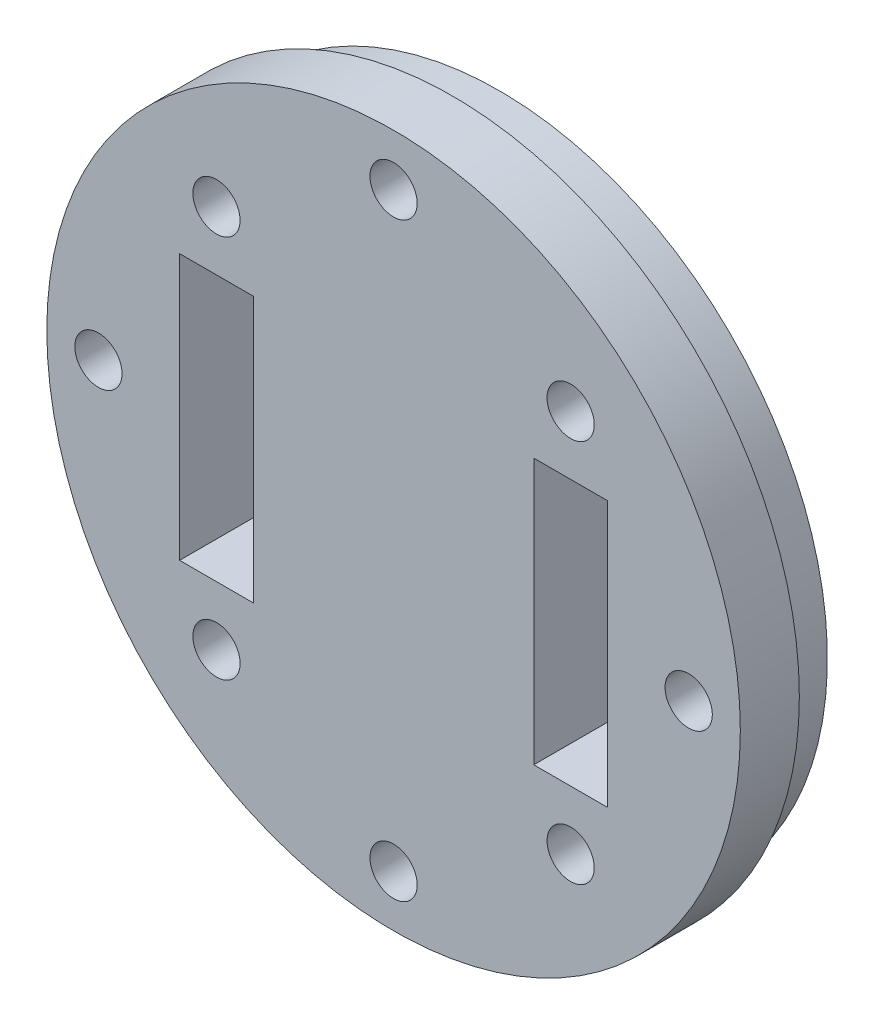
ISO-10303-21;
HEADER;
FILE_DESCRIPTION(('STEP AP214'),'2;1');
FILE_NAME('part.step','',(''),(''),'','','');
FILE_SCHEMA(('AUTOMOTIVE_DESIGN { 1 0 10303 214 1 1 1 1 }'));
ENDSEC;
DATA;
#1=APPLICATION_CONTEXT('core data for automotive mechanical design processes');
#2=APPLICATION_PROTOCOL_DEFINITION('international standard','automotive_design',2000,#1);
#3=PRODUCT_CONTEXT('',#1,'mechanical');
#4=PRODUCT('Part','Part','',(#3));
#5=PRODUCT_RELATED_PRODUCT_CATEGORY('part','',(#4));
#6=PRODUCT_DEFINITION_FORMATION('','',#4);
#7=PRODUCT_DEFINITION_CONTEXT('part definition',#1,'design');
#8=PRODUCT_DEFINITION('design','',#6,#7);
#9=PRODUCT_DEFINITION_SHAPE('','',#8);
#10=(LENGTH_UNIT() NAMED_UNIT(*) SI_UNIT(.MILLI.,.METRE.));
#11=(NAMED_UNIT(*) PLANE_ANGLE_UNIT() SI_UNIT($,.RADIAN.));
#12=(NAMED_UNIT(*) SI_UNIT($,.STERADIAN.) SOLID_ANGLE_UNIT());
#13=UNCERTAINTY_MEASURE_WITH_UNIT(LENGTH_MEASURE(1.E-05),#10,'distance_accuracy_value','');
#14=(GEOMETRIC_REPRESENTATION_CONTEXT(3) GLOBAL_UNCERTAINTY_ASSIGNED_CONTEXT((#13)) GLOBAL_UNIT_ASSIGNED_CONTEXT((#10,
#11,#12)) REPRESENTATION_CONTEXT('',''));
#15=CARTESIAN_POINT('',(0.,0.,0.));
#16=DIRECTION('',(0.,0.,1.));
#17=DIRECTION('',(1.,0.,0.));
#18=AXIS2_PLACEMENT_3D('',#15,#16,#17);
#19=CARTESIAN_POINT('',(0.,0.,4.));
#20=DIRECTION('',(0.,0.,-1.));
#21=DIRECTION('',(-1.,0.,0.));
#22=AXIS2_PLACEMENT_3D('',#19,#20,#21);
#23=CYLINDRICAL_SURFACE('',#22,23.5);
#24=CARTESIAN_POINT('',(0.,0.,4.));
#25=DIRECTION('',(0.,0.,1.));
#26=DIRECTION('',(1.,0.,0.));
#27=AXIS2_PLACEMENT_3D('',#24,#25,#26);
#28=CIRCLE('',#27,23.5);
#29=CARTESIAN_POINT('',(23.5,0.,4.));
#30=VERTEX_POINT('',#29);
#31=EDGE_CURVE('E47',#30,#30,#28,.T.);
#32=ORIENTED_EDGE('',*,*,#31,.F.);
#33=EDGE_LOOP('',(#32));
#34=FACE_BOUND('',#33,.T.);
#35=CARTESIAN_POINT('',(0.,0.,0.));
#36=DIRECTION('',(0.,0.,1.));
#37=DIRECTION('',(1.,0.,0.));
#38=AXIS2_PLACEMENT_3D('',#35,#36,#37);
#39=CIRCLE('',#38,23.5);
#40=CARTESIAN_POINT('',(23.5,0.,0.));
#41=VERTEX_POINT('',#40);
#42=EDGE_CURVE('E42',#41,#41,#39,.T.);
#43=ORIENTED_EDGE('',*,*,#42,.T.);
#44=EDGE_LOOP('',(#43));
#45=FACE_BOUND('',#44,.T.);
#46=ADVANCED_FACE('F39',(#34,#45),#23,.T.);
#47=CARTESIAN_POINT('',(0.,0.,4.));
#48=DIRECTION('',(0.,0.,1.));
#49=DIRECTION('',(1.,0.,0.));
#50=AXIS2_PLACEMENT_3D('',#47,#48,#49);
#51=PLANE('',#50);
#52=CARTESIAN_POINT('',(-12.,13.,4.));
#53=DIRECTION('',(0.,0.,-1.));
#54=DIRECTION('',(1.,0.,0.));
#55=AXIS2_PLACEMENT_3D('',#52,#53,#54);
#56=CIRCLE('',#55,1.6);
#57=CARTESIAN_POINT('',(-10.4,13.,4.));
#58=VERTEX_POINT('',#57);
#59=EDGE_CURVE('E448',#58,#58,#56,.T.);
#60=ORIENTED_EDGE('',*,*,#59,.T.);
#61=EDGE_LOOP('',(#60));
#62=FACE_BOUND('',#61,.T.);
#63=CARTESIAN_POINT('',(-12.,-13.,4.));
#64=DIRECTION('',(0.,0.,-1.));
#65=DIRECTION('',(-1.,0.,0.));
#66=AXIS2_PLACEMENT_3D('',#63,#64,#65);
#67=CIRCLE('',#66,1.6);
#68=CARTESIAN_POINT('',(-13.6,-13.,4.));
#69=VERTEX_POINT('',#68);
#70=EDGE_CURVE('E469',#69,#69,#67,.T.);
#71=ORIENTED_EDGE('',*,*,#70,.T.);
#72=EDGE_LOOP('',(#71));
#73=FACE_BOUND('',#72,.T.);
#74=CARTESIAN_POINT('',(12.,-13.,4.));
#75=DIRECTION('',(0.,0.,-1.));
#76=DIRECTION('',(1.,0.,0.));
#77=AXIS2_PLACEMENT_3D('',#74,#75,#76);
#78=CIRCLE('',#77,1.6);
#79=CARTESIAN_POINT('',(13.6,-13.,4.));
#80=VERTEX_POINT('',#79);
#81=EDGE_CURVE('E460',#80,#80,#78,.T.);
#82=ORIENTED_EDGE('',*,*,#81,.T.);
#83=EDGE_LOOP('',(#82));
#84=FACE_BOUND('',#83,.T.);
#85=CARTESIAN_POINT('',(12.,13.,4.));
#86=DIRECTION('',(0.,0.,-1.));
#87=DIRECTION('',(-1.,0.,0.));
#88=AXIS2_PLACEMENT_3D('',#85,#86,#87);
#89=CIRCLE('',#88,1.6);
#90=CARTESIAN_POINT('',(10.4,13.,4.));
#91=VERTEX_POINT('',#90);
#92=EDGE_CURVE('E165',#91,#91,#89,.T.);
#93=ORIENTED_EDGE('',*,*,#92,.T.);
#94=EDGE_LOOP('',(#93));
#95=FACE_BOUND('',#94,.T.);
#96=DIRECTION('',(0.,1.,0.));
#97=VECTOR('',#96,1.);
#98=CARTESIAN_POINT('',(-14.5,9.,4.));
#99=LINE('',#98,#97);
#100=CARTESIAN_POINT('',(-14.5,-9.,4.));
#101=VERTEX_POINT('',#100);
#102=CARTESIAN_POINT('',(-14.5,9.,4.));
#103=VERTEX_POINT('',#102);
#104=EDGE_CURVE('E109',#101,#103,#99,.T.);
#105=ORIENTED_EDGE('',*,*,#104,.T.);
#106=DIRECTION('',(1.,0.,0.));
#107=VECTOR('',#106,1.);
#108=CARTESIAN_POINT('',(-9.5,9.,4.));
#109=LINE('',#108,#107);
#110=CARTESIAN_POINT('',(-9.5,9.,4.));
#111=VERTEX_POINT('',#110);
#112=EDGE_CURVE('E120',#103,#111,#109,.T.);
#113=ORIENTED_EDGE('',*,*,#112,.T.);
#114=DIRECTION('',(0.,-1.,0.));
#115=VECTOR('',#114,1.);
#116=CARTESIAN_POINT('',(-9.5,9.,4.));
#117=LINE('',#116,#115);
#118=CARTESIAN_POINT('',(-9.5,-9.,4.));
#119=VERTEX_POINT('',#118);
#120=EDGE_CURVE('E55',#111,#119,#117,.T.);
#121=ORIENTED_EDGE('',*,*,#120,.T.);
#122=DIRECTION('',(-1.,0.,0.));
#123=VECTOR('',#122,1.);
#124=CARTESIAN_POINT('',(-9.5,-9.,4.));
#125=LINE('',#124,#123);
#126=EDGE_CURVE('E117',#119,#101,#125,.T.);
#127=ORIENTED_EDGE('',*,*,#126,.T.);
#128=EDGE_LOOP('',(#105,#113,#121,#127));
#129=FACE_BOUND('',#128,.T.);
#130=DIRECTION('',(0.,1.,0.));
#131=VECTOR('',#130,1.);
#132=CARTESIAN_POINT('',(9.5,9.,4.));
#133=LINE('',#132,#131);
#134=CARTESIAN_POINT('',(9.49999999999999,-9.,4.));
#135=VERTEX_POINT('',#134);
#136=CARTESIAN_POINT('',(9.5,9.,4.));
#137=VERTEX_POINT('',#136);
#138=EDGE_CURVE('E150',#135,#137,#133,.T.);
#139=ORIENTED_EDGE('',*,*,#138,.T.);
#140=DIRECTION('',(1.,0.,0.));
#141=VECTOR('',#140,1.);
#142=CARTESIAN_POINT('',(9.5,9.,4.));
#143=LINE('',#142,#141);
#144=CARTESIAN_POINT('',(14.5,9.,4.));
#145=VERTEX_POINT('',#144);
#146=EDGE_CURVE('E153',#137,#145,#143,.T.);
#147=ORIENTED_EDGE('',*,*,#146,.T.);
#148=DIRECTION('',(0.,-1.,0.));
#149=VECTOR('',#148,1.);
#150=CARTESIAN_POINT('',(14.5,9.,4.));
#151=LINE('',#150,#149);
#152=CARTESIAN_POINT('',(14.5,-9.,4.));
#153=VERTEX_POINT('',#152);
#154=EDGE_CURVE('E63',#145,#153,#151,.T.);
#155=ORIENTED_EDGE('',*,*,#154,.T.);
#156=DIRECTION('',(-1.,0.,0.));
#157=VECTOR('',#156,1.);
#158=CARTESIAN_POINT('',(9.49999999999999,-9.,4.));
#159=LINE('',#158,#157);
#160=EDGE_CURVE('E158',#153,#135,#159,.T.);
#161=ORIENTED_EDGE('',*,*,#160,.T.);
#162=EDGE_LOOP('',(#139,#147,#155,#161));
#163=FACE_BOUND('',#162,.T.);
#164=CARTESIAN_POINT('',(0.,20.,4.));
#165=DIRECTION('',(0.,0.,-1.));
#166=DIRECTION('',(-1.,0.,0.));
#167=AXIS2_PLACEMENT_3D('',#164,#165,#166);
#168=CIRCLE('',#167,1.6);
#169=CARTESIAN_POINT('',(-1.6,20.,4.));
#170=VERTEX_POINT('',#169);
#171=EDGE_CURVE('E180',#170,#170,#168,.T.);
#172=ORIENTED_EDGE('',*,*,#171,.T.);
#173=EDGE_LOOP('',(#172));
#174=FACE_BOUND('',#173,.T.);
#175=CARTESIAN_POINT('',(-20.,0.,4.));
#176=DIRECTION('',(0.,0.,-1.));
#177=DIRECTION('',(-1.,0.,0.));
#178=AXIS2_PLACEMENT_3D('',#175,#176,#177);
#179=CIRCLE('',#178,1.6);
#180=CARTESIAN_POINT('',(-21.6,0.,4.));
#181=VERTEX_POINT('',#180);
#182=EDGE_CURVE('E187',#181,#181,#179,.T.);
#183=ORIENTED_EDGE('',*,*,#182,.T.);
#184=EDGE_LOOP('',(#183));
#185=FACE_BOUND('',#184,.T.);
#186=CARTESIAN_POINT('',(0.,-20.,4.));
#187=DIRECTION('',(0.,0.,-1.));
#188=DIRECTION('',(-1.,0.,0.));
#189=AXIS2_PLACEMENT_3D('',#186,#187,#188);
#190=CIRCLE('',#189,1.6);
#191=CARTESIAN_POINT('',(-1.6,-20.,4.));
#192=VERTEX_POINT('',#191);
#193=EDGE_CURVE('E193',#192,#192,#190,.T.);
#194=ORIENTED_EDGE('',*,*,#193,.T.);
#195=EDGE_LOOP('',(#194));
#196=FACE_BOUND('',#195,.T.);
#197=CARTESIAN_POINT('',(20.,0.,4.));
#198=DIRECTION('',(0.,0.,-1.));
#199=DIRECTION('',(-1.,0.,0.));
#200=AXIS2_PLACEMENT_3D('',#197,#198,#199);
#201=CIRCLE('',#200,1.6);
#202=CARTESIAN_POINT('',(18.4,0.,4.));
#203=VERTEX_POINT('',#202);
#204=EDGE_CURVE('E199',#203,#203,#201,.T.);
#205=ORIENTED_EDGE('',*,*,#204,.T.);
#206=EDGE_LOOP('',(#205));
#207=FACE_BOUND('',#206,.T.);
#208=ORIENTED_EDGE('',*,*,#31,.T.);
#209=EDGE_LOOP('',(#208));
#210=FACE_BOUND('',#209,.T.);
#211=ADVANCED_FACE('F124',(#62,#73,#84,#95,#129,#163,#174,#185,#196,#207,#210),#51,.T.);
#212=CARTESIAN_POINT('',(0.,0.,0.));
#213=DIRECTION('',(0.,0.,1.));
#214=DIRECTION('',(1.,0.,0.));
#215=AXIS2_PLACEMENT_3D('',#212,#213,#214);
#216=PLANE('',#215);
#217=CARTESIAN_POINT('',(0.,0.,0.));
#218=DIRECTION('',(0.,0.,-1.));
#219=DIRECTION('',(-1.,0.,0.));
#220=AXIS2_PLACEMENT_3D('',#217,#218,#219);
#221=CIRCLE('',#220,22.225);
#222=CARTESIAN_POINT('',(-22.225,0.,0.));
#223=VERTEX_POINT('',#222);
#224=EDGE_CURVE('E11',#223,#223,#221,.T.);
#225=ORIENTED_EDGE('',*,*,#224,.F.);
#226=EDGE_LOOP('',(#225));
#227=FACE_BOUND('',#226,.T.);
#228=ORIENTED_EDGE('',*,*,#42,.F.);
#229=EDGE_LOOP('',(#228));
#230=FACE_BOUND('',#229,.T.);
#231=ADVANCED_FACE('F212',(#227,#230),#216,.F.);
#232=CARTESIAN_POINT('',(0.,0.,-3.175));
#233=DIRECTION('',(0.,0.,1.));
#234=DIRECTION('',(1.,0.,0.));
#235=AXIS2_PLACEMENT_3D('',#232,#233,#234);
#236=CYLINDRICAL_SURFACE('',#235,22.225);
#237=CARTESIAN_POINT('',(0.,0.,-3.175));
#238=DIRECTION('',(0.,0.,-1.));
#239=DIRECTION('',(-1.,0.,0.));
#240=AXIS2_PLACEMENT_3D('',#237,#238,#239);
#241=CIRCLE('',#240,22.225);
#242=CARTESIAN_POINT('',(-22.225,0.,-3.175));
#243=VERTEX_POINT('',#242);
#244=EDGE_CURVE('E183',#243,#243,#241,.T.);
#245=ORIENTED_EDGE('',*,*,#244,.F.);
#246=EDGE_LOOP('',(#245));
#247=FACE_BOUND('',#246,.T.);
#248=ORIENTED_EDGE('',*,*,#224,.T.);
#249=EDGE_LOOP('',(#248));
#250=FACE_BOUND('',#249,.T.);
#251=ADVANCED_FACE('F214',(#247,#250),#236,.T.);
#252=CARTESIAN_POINT('',(0.,0.,-3.175));
#253=DIRECTION('',(0.,0.,-1.));
#254=DIRECTION('',(-1.,0.,0.));
#255=AXIS2_PLACEMENT_3D('',#252,#253,#254);
#256=PLANE('',#255);
#257=CARTESIAN_POINT('',(-12.,13.,-3.175));
#258=DIRECTION('',(0.,0.,-1.));
#259=DIRECTION('',(1.,0.,0.));
#260=AXIS2_PLACEMENT_3D('',#257,#258,#259);
#261=CIRCLE('',#260,1.6);
#262=CARTESIAN_POINT('',(-10.4,13.,-3.175));
#263=VERTEX_POINT('',#262);
#264=EDGE_CURVE('E451',#263,#263,#261,.T.);
#265=ORIENTED_EDGE('',*,*,#264,.F.);
#266=EDGE_LOOP('',(#265));
#267=FACE_BOUND('',#266,.T.);
#268=CARTESIAN_POINT('',(-12.,-13.,-3.175));
#269=DIRECTION('',(0.,0.,-1.));
#270=DIRECTION('',(-1.,0.,0.));
#271=AXIS2_PLACEMENT_3D('',#268,#269,#270);
#272=CIRCLE('',#271,1.6);
#273=CARTESIAN_POINT('',(-13.6,-13.,-3.175));
#274=VERTEX_POINT('',#273);
#275=EDGE_CURVE('E453',#274,#274,#272,.T.);
#276=ORIENTED_EDGE('',*,*,#275,.F.);
#277=EDGE_LOOP('',(#276));
#278=FACE_BOUND('',#277,.T.);
#279=CARTESIAN_POINT('',(12.,-13.,-3.175));
#280=DIRECTION('',(0.,0.,-1.));
#281=DIRECTION('',(1.,0.,0.));
#282=AXIS2_PLACEMENT_3D('',#279,#280,#281);
#283=CIRCLE('',#282,1.6);
#284=CARTESIAN_POINT('',(13.6,-13.,-3.175));
#285=VERTEX_POINT('',#284);
#286=EDGE_CURVE('E464',#285,#285,#283,.T.);
#287=ORIENTED_EDGE('',*,*,#286,.F.);
#288=EDGE_LOOP('',(#287));
#289=FACE_BOUND('',#288,.T.);
#290=CARTESIAN_POINT('',(12.,13.,-3.175));
#291=DIRECTION('',(0.,0.,-1.));
#292=DIRECTION('',(-1.,0.,0.));
#293=AXIS2_PLACEMENT_3D('',#290,#291,#292);
#294=CIRCLE('',#293,1.6);
#295=CARTESIAN_POINT('',(10.4,13.,-3.175));
#296=VERTEX_POINT('',#295);
#297=EDGE_CURVE('E133',#296,#296,#294,.T.);
#298=ORIENTED_EDGE('',*,*,#297,.F.);
#299=EDGE_LOOP('',(#298));
#300=FACE_BOUND('',#299,.T.);
#301=DIRECTION('',(0.,1.,0.));
#302=VECTOR('',#301,1.);
#303=CARTESIAN_POINT('',(-14.5,9.,-3.175));
#304=LINE('',#303,#302);
#305=CARTESIAN_POINT('',(-14.5,-9.,-3.175));
#306=VERTEX_POINT('',#305);
#307=CARTESIAN_POINT('',(-14.5,9.,-3.175));
#308=VERTEX_POINT('',#307);
#309=EDGE_CURVE('E112',#306,#308,#304,.T.);
#310=ORIENTED_EDGE('',*,*,#309,.F.);
#311=DIRECTION('',(-1.,0.,0.));
#312=VECTOR('',#311,1.);
#313=CARTESIAN_POINT('',(-9.5,-9.,-3.175));
#314=LINE('',#313,#312);
#315=CARTESIAN_POINT('',(-9.5,-9.,-3.175));
#316=VERTEX_POINT('',#315);
#317=EDGE_CURVE('E127',#316,#306,#314,.T.);
#318=ORIENTED_EDGE('',*,*,#317,.F.);
#319=DIRECTION('',(0.,-1.,0.));
#320=VECTOR('',#319,1.);
#321=CARTESIAN_POINT('',(-9.5,9.,-3.175));
#322=LINE('',#321,#320);
#323=CARTESIAN_POINT('',(-9.5,9.,-3.175));
#324=VERTEX_POINT('',#323);
#325=EDGE_CURVE('E130',#324,#316,#322,.T.);
#326=ORIENTED_EDGE('',*,*,#325,.F.);
#327=DIRECTION('',(1.,0.,0.));
#328=VECTOR('',#327,1.);
#329=CARTESIAN_POINT('',(-9.5,9.,-3.175));
#330=LINE('',#329,#328);
#331=EDGE_CURVE('E139',#308,#324,#330,.T.);
#332=ORIENTED_EDGE('',*,*,#331,.F.);
#333=EDGE_LOOP('',(#310,#318,#326,#332));
#334=FACE_BOUND('',#333,.T.);
#335=DIRECTION('',(0.,1.,0.));
#336=VECTOR('',#335,1.);
#337=CARTESIAN_POINT('',(9.5,9.,-3.175));
#338=LINE('',#337,#336);
#339=CARTESIAN_POINT('',(9.49999999999999,-9.,-3.175));
#340=VERTEX_POINT('',#339);
#341=CARTESIAN_POINT('',(9.5,9.,-3.175));
#342=VERTEX_POINT('',#341);
#343=EDGE_CURVE('E162',#340,#342,#338,.T.);
#344=ORIENTED_EDGE('',*,*,#343,.F.);
#345=DIRECTION('',(-1.,0.,0.));
#346=VECTOR('',#345,1.);
#347=CARTESIAN_POINT('',(9.49999999999999,-9.,-3.175));
#348=LINE('',#347,#346);
#349=CARTESIAN_POINT('',(14.5,-9.,-3.175));
#350=VERTEX_POINT('',#349);
#351=EDGE_CURVE('E154',#350,#340,#348,.T.);
#352=ORIENTED_EDGE('',*,*,#351,.F.);
#353=DIRECTION('',(0.,-1.,0.));
#354=VECTOR('',#353,1.);
#355=CARTESIAN_POINT('',(14.5,9.,-3.175));
#356=LINE('',#355,#354);
#357=CARTESIAN_POINT('',(14.5,9.,-3.175));
#358=VERTEX_POINT('',#357);
#359=EDGE_CURVE('E168',#358,#350,#356,.T.);
#360=ORIENTED_EDGE('',*,*,#359,.F.);
#361=DIRECTION('',(1.,0.,0.));
#362=VECTOR('',#361,1.);
#363=CARTESIAN_POINT('',(9.5,9.,-3.175));
#364=LINE('',#363,#362);
#365=EDGE_CURVE('E164',#342,#358,#364,.T.);
#366=ORIENTED_EDGE('',*,*,#365,.F.);
#367=EDGE_LOOP('',(#344,#352,#360,#366));
#368=FACE_BOUND('',#367,.T.);
#369=CARTESIAN_POINT('',(0.,20.,-3.175));
#370=DIRECTION('',(0.,0.,-1.));
#371=DIRECTION('',(-1.,0.,0.));
#372=AXIS2_PLACEMENT_3D('',#369,#370,#371);
#373=CIRCLE('',#372,1.6);
#374=CARTESIAN_POINT('',(-1.6,20.,-3.175));
#375=VERTEX_POINT('',#374);
#376=EDGE_CURVE('E184',#375,#375,#373,.T.);
#377=ORIENTED_EDGE('',*,*,#376,.F.);
#378=EDGE_LOOP('',(#377));
#379=FACE_BOUND('',#378,.T.);
#380=CARTESIAN_POINT('',(-20.,0.,-3.175));
#381=DIRECTION('',(0.,0.,-1.));
#382=DIRECTION('',(-1.,0.,0.));
#383=AXIS2_PLACEMENT_3D('',#380,#381,#382);
#384=CIRCLE('',#383,1.6);
#385=CARTESIAN_POINT('',(-21.6,0.,-3.175));
#386=VERTEX_POINT('',#385);
#387=EDGE_CURVE('E190',#386,#386,#384,.T.);
#388=ORIENTED_EDGE('',*,*,#387,.F.);
#389=EDGE_LOOP('',(#388));
#390=FACE_BOUND('',#389,.T.);
#391=CARTESIAN_POINT('',(0.,-20.,-3.175));
#392=DIRECTION('',(0.,0.,-1.));
#393=DIRECTION('',(-1.,0.,0.));
#394=AXIS2_PLACEMENT_3D('',#391,#392,#393);
#395=CIRCLE('',#394,1.6);
#396=CARTESIAN_POINT('',(-1.6,-20.,-3.175));
#397=VERTEX_POINT('',#396);
#398=EDGE_CURVE('E196',#397,#397,#395,.T.);
#399=ORIENTED_EDGE('',*,*,#398,.F.);
#400=EDGE_LOOP('',(#399));
#401=FACE_BOUND('',#400,.T.);
#402=CARTESIAN_POINT('',(20.,0.,-3.175));
#403=DIRECTION('',(0.,0.,-1.));
#404=DIRECTION('',(-1.,0.,0.));
#405=AXIS2_PLACEMENT_3D('',#402,#403,#404);
#406=CIRCLE('',#405,1.6);
#407=CARTESIAN_POINT('',(18.4,0.,-3.175));
#408=VERTEX_POINT('',#407);
#409=EDGE_CURVE('E146',#408,#408,#406,.T.);
#410=ORIENTED_EDGE('',*,*,#409,.F.);
#411=EDGE_LOOP('',(#410));
#412=FACE_BOUND('',#411,.T.);
#413=ORIENTED_EDGE('',*,*,#244,.T.);
#414=EDGE_LOOP('',(#413));
#415=FACE_BOUND('',#414,.T.);
#416=ADVANCED_FACE('F220',(#267,#278,#289,#300,#334,#368,#379,#390,#401,#412,#415),#256,.T.);
#417=CARTESIAN_POINT('',(20.,0.,4.));
#418=DIRECTION('',(0.,0.,-1.));
#419=DIRECTION('',(-1.,0.,0.));
#420=AXIS2_PLACEMENT_3D('',#417,#418,#419);
#421=CYLINDRICAL_SURFACE('',#420,1.6);
#422=ORIENTED_EDGE('',*,*,#204,.F.);
#423=EDGE_LOOP('',(#422));
#424=FACE_BOUND('',#423,.T.);
#425=ORIENTED_EDGE('',*,*,#409,.T.);
#426=EDGE_LOOP('',(#425));
#427=FACE_BOUND('',#426,.T.);
#428=ADVANCED_FACE('F249',(#424,#427),#421,.F.);
#429=CARTESIAN_POINT('',(0.,-20.,4.));
#430=DIRECTION('',(0.,0.,-1.));
#431=DIRECTION('',(-1.,0.,0.));
#432=AXIS2_PLACEMENT_3D('',#429,#430,#431);
#433=CYLINDRICAL_SURFACE('',#432,1.6);
#434=ORIENTED_EDGE('',*,*,#193,.F.);
#435=EDGE_LOOP('',(#434));
#436=FACE_BOUND('',#435,.T.);
#437=ORIENTED_EDGE('',*,*,#398,.T.);
#438=EDGE_LOOP('',(#437));
#439=FACE_BOUND('',#438,.T.);
#440=ADVANCED_FACE('F332',(#436,#439),#433,.F.);
#441=CARTESIAN_POINT('',(-20.,0.,4.));
#442=DIRECTION('',(0.,0.,-1.));
#443=DIRECTION('',(-1.,0.,0.));
#444=AXIS2_PLACEMENT_3D('',#441,#442,#443);
#445=CYLINDRICAL_SURFACE('',#444,1.6);
#446=ORIENTED_EDGE('',*,*,#182,.F.);
#447=EDGE_LOOP('',(#446));
#448=FACE_BOUND('',#447,.T.);
#449=ORIENTED_EDGE('',*,*,#387,.T.);
#450=EDGE_LOOP('',(#449));
#451=FACE_BOUND('',#450,.T.);
#452=ADVANCED_FACE('F328',(#448,#451),#445,.F.);
#453=CARTESIAN_POINT('',(0.,20.,4.));
#454=DIRECTION('',(0.,0.,-1.));
#455=DIRECTION('',(-1.,0.,0.));
#456=AXIS2_PLACEMENT_3D('',#453,#454,#455);
#457=CYLINDRICAL_SURFACE('',#456,1.6);
#458=ORIENTED_EDGE('',*,*,#171,.F.);
#459=EDGE_LOOP('',(#458));
#460=FACE_BOUND('',#459,.T.);
#461=ORIENTED_EDGE('',*,*,#376,.T.);
#462=EDGE_LOOP('',(#461));
#463=FACE_BOUND('',#462,.T.);
#464=ADVANCED_FACE('F324',(#460,#463),#457,.F.);
#465=CARTESIAN_POINT('',(9.5,9.,4.));
#466=DIRECTION('',(-1.,0.,0.));
#467=DIRECTION('',(0.,-1.,0.));
#468=AXIS2_PLACEMENT_3D('',#465,#466,#467);
#469=PLANE('',#468);
#470=ORIENTED_EDGE('',*,*,#343,.T.);
#471=DIRECTION('',(0.,0.,-1.));
#472=VECTOR('',#471,1.);
#473=CARTESIAN_POINT('',(9.5,9.,4.));
#474=LINE('',#473,#472);
#475=EDGE_CURVE('E161',#137,#342,#474,.T.);
#476=ORIENTED_EDGE('',*,*,#475,.F.);
#477=ORIENTED_EDGE('',*,*,#138,.F.);
#478=DIRECTION('',(0.,0.,-1.));
#479=VECTOR('',#478,1.);
#480=CARTESIAN_POINT('',(9.49999999999999,-9.,4.));
#481=LINE('',#480,#479);
#482=EDGE_CURVE('E140',#135,#340,#481,.T.);
#483=ORIENTED_EDGE('',*,*,#482,.T.);
#484=EDGE_LOOP('',(#470,#476,#477,#483));
#485=FACE_BOUND('',#484,.T.);
#486=ADVANCED_FACE('F315',(#485),#469,.F.);
#487=CARTESIAN_POINT('',(9.49999999999999,-9.,4.));
#488=DIRECTION('',(0.,-1.,0.));
#489=DIRECTION('',(1.,0.,0.));
#490=AXIS2_PLACEMENT_3D('',#487,#488,#489);
#491=PLANE('',#490);
#492=ORIENTED_EDGE('',*,*,#351,.T.);
#493=ORIENTED_EDGE('',*,*,#482,.F.);
#494=ORIENTED_EDGE('',*,*,#160,.F.);
#495=DIRECTION('',(0.,0.,-1.));
#496=VECTOR('',#495,1.);
#497=CARTESIAN_POINT('',(14.5,-9.,4.));
#498=LINE('',#497,#496);
#499=EDGE_CURVE('E174',#153,#350,#498,.T.);
#500=ORIENTED_EDGE('',*,*,#499,.T.);
#501=EDGE_LOOP('',(#492,#493,#494,#500));
#502=FACE_BOUND('',#501,.T.);
#503=ADVANCED_FACE('F311',(#502),#491,.F.);
#504=CARTESIAN_POINT('',(14.5,9.,4.));
#505=DIRECTION('',(1.,0.,0.));
#506=DIRECTION('',(0.,1.,0.));
#507=AXIS2_PLACEMENT_3D('',#504,#505,#506);
#508=PLANE('',#507);
#509=ORIENTED_EDGE('',*,*,#359,.T.);
#510=ORIENTED_EDGE('',*,*,#499,.F.);
#511=ORIENTED_EDGE('',*,*,#154,.F.);
#512=DIRECTION('',(0.,0.,-1.));
#513=VECTOR('',#512,1.);
#514=CARTESIAN_POINT('',(14.5,9.,4.));
#515=LINE('',#514,#513);
#516=EDGE_CURVE('E176',#145,#358,#515,.T.);
#517=ORIENTED_EDGE('',*,*,#516,.T.);
#518=EDGE_LOOP('',(#509,#510,#511,#517));
#519=FACE_BOUND('',#518,.T.);
#520=ADVANCED_FACE('F314',(#519),#508,.F.);
#521=CARTESIAN_POINT('',(9.5,9.,4.));
#522=DIRECTION('',(0.,1.,0.));
#523=DIRECTION('',(-1.,0.,0.));
#524=AXIS2_PLACEMENT_3D('',#521,#522,#523);
#525=PLANE('',#524);
#526=ORIENTED_EDGE('',*,*,#365,.T.);
#527=ORIENTED_EDGE('',*,*,#516,.F.);
#528=ORIENTED_EDGE('',*,*,#146,.F.);
#529=ORIENTED_EDGE('',*,*,#475,.T.);
#530=EDGE_LOOP('',(#526,#527,#528,#529));
#531=FACE_BOUND('',#530,.T.);
#532=ADVANCED_FACE('F310',(#531),#525,.F.);
#533=CARTESIAN_POINT('',(-14.5,9.,4.));
#534=DIRECTION('',(-1.,0.,0.));
#535=DIRECTION('',(0.,-1.,0.));
#536=AXIS2_PLACEMENT_3D('',#533,#534,#535);
#537=PLANE('',#536);
#538=ORIENTED_EDGE('',*,*,#309,.T.);
#539=DIRECTION('',(0.,0.,-1.));
#540=VECTOR('',#539,1.);
#541=CARTESIAN_POINT('',(-14.5,9.,4.));
#542=LINE('',#541,#540);
#543=EDGE_CURVE('E105',#103,#308,#542,.T.);
#544=ORIENTED_EDGE('',*,*,#543,.F.);
#545=ORIENTED_EDGE('',*,*,#104,.F.);
#546=DIRECTION('',(0.,0.,-1.));
#547=VECTOR('',#546,1.);
#548=CARTESIAN_POINT('',(-14.5,-9.,4.));
#549=LINE('',#548,#547);
#550=EDGE_CURVE('E144',#101,#306,#549,.T.);
#551=ORIENTED_EDGE('',*,*,#550,.T.);
#552=EDGE_LOOP('',(#538,#544,#545,#551));
#553=FACE_BOUND('',#552,.T.);
#554=ADVANCED_FACE('F107',(#553),#537,.F.);
#555=CARTESIAN_POINT('',(-9.5,-9.,4.));
#556=DIRECTION('',(0.,-1.,0.));
#557=DIRECTION('',(0.,0.,-1.));
#558=AXIS2_PLACEMENT_3D('',#555,#556,#557);
#559=PLANE('',#558);
#560=ORIENTED_EDGE('',*,*,#317,.T.);
#561=ORIENTED_EDGE('',*,*,#550,.F.);
#562=ORIENTED_EDGE('',*,*,#126,.F.);
#563=DIRECTION('',(0.,0.,-1.));
#564=VECTOR('',#563,1.);
#565=CARTESIAN_POINT('',(-9.5,-9.,4.));
#566=LINE('',#565,#564);
#567=EDGE_CURVE('E147',#119,#316,#566,.T.);
#568=ORIENTED_EDGE('',*,*,#567,.T.);
#569=EDGE_LOOP('',(#560,#561,#562,#568));
#570=FACE_BOUND('',#569,.T.);
#571=ADVANCED_FACE('F300',(#570),#559,.F.);
#572=CARTESIAN_POINT('',(-9.5,9.,4.));
#573=DIRECTION('',(1.,0.,0.));
#574=DIRECTION('',(0.,1.,0.));
#575=AXIS2_PLACEMENT_3D('',#572,#573,#574);
#576=PLANE('',#575);
#577=ORIENTED_EDGE('',*,*,#325,.T.);
#578=ORIENTED_EDGE('',*,*,#567,.F.);
#579=ORIENTED_EDGE('',*,*,#120,.F.);
#580=DIRECTION('',(0.,0.,-1.));
#581=VECTOR('',#580,1.);
#582=CARTESIAN_POINT('',(-9.5,9.,4.));
#583=LINE('',#582,#581);
#584=EDGE_CURVE('E116',#111,#324,#583,.T.);
#585=ORIENTED_EDGE('',*,*,#584,.T.);
#586=EDGE_LOOP('',(#577,#578,#579,#585));
#587=FACE_BOUND('',#586,.T.);
#588=ADVANCED_FACE('F303',(#587),#576,.F.);
#589=CARTESIAN_POINT('',(-9.5,9.,4.));
#590=DIRECTION('',(0.,1.,0.));
#591=DIRECTION('',(0.,0.,1.));
#592=AXIS2_PLACEMENT_3D('',#589,#590,#591);
#593=PLANE('',#592);
#594=ORIENTED_EDGE('',*,*,#331,.T.);
#595=ORIENTED_EDGE('',*,*,#584,.F.);
#596=ORIENTED_EDGE('',*,*,#112,.F.);
#597=ORIENTED_EDGE('',*,*,#543,.T.);
#598=EDGE_LOOP('',(#594,#595,#596,#597));
#599=FACE_BOUND('',#598,.T.);
#600=ADVANCED_FACE('F121',(#599),#593,.F.);
#601=CARTESIAN_POINT('',(12.,13.,4.));
#602=DIRECTION('',(0.,0.,-1.));
#603=DIRECTION('',(-1.,0.,0.));
#604=AXIS2_PLACEMENT_3D('',#601,#602,#603);
#605=CYLINDRICAL_SURFACE('',#604,1.6);
#606=ORIENTED_EDGE('',*,*,#92,.F.);
#607=EDGE_LOOP('',(#606));
#608=FACE_BOUND('',#607,.T.);
#609=ORIENTED_EDGE('',*,*,#297,.T.);
#610=EDGE_LOOP('',(#609));
#611=FACE_BOUND('',#610,.T.);
#612=ADVANCED_FACE('F258',(#608,#611),#605,.F.);
#613=CARTESIAN_POINT('',(12.,-13.,4.));
#614=DIRECTION('',(0.,0.,-1.));
#615=DIRECTION('',(-1.,0.,0.));
#616=AXIS2_PLACEMENT_3D('',#613,#614,#615);
#617=CYLINDRICAL_SURFACE('',#616,1.6);
#618=ORIENTED_EDGE('',*,*,#81,.F.);
#619=EDGE_LOOP('',(#618));
#620=FACE_BOUND('',#619,.T.);
#621=ORIENTED_EDGE('',*,*,#286,.T.);
#622=EDGE_LOOP('',(#621));
#623=FACE_BOUND('',#622,.T.);
#624=ADVANCED_FACE('F263',(#620,#623),#617,.F.);
#625=CARTESIAN_POINT('',(-12.,-13.,4.));
#626=DIRECTION('',(0.,0.,-1.));
#627=DIRECTION('',(-1.,0.,0.));
#628=AXIS2_PLACEMENT_3D('',#625,#626,#627);
#629=CYLINDRICAL_SURFACE('',#628,1.6);
#630=ORIENTED_EDGE('',*,*,#70,.F.);
#631=EDGE_LOOP('',(#630));
#632=FACE_BOUND('',#631,.T.);
#633=ORIENTED_EDGE('',*,*,#275,.T.);
#634=EDGE_LOOP('',(#633));
#635=FACE_BOUND('',#634,.T.);
#636=ADVANCED_FACE('F273',(#632,#635),#629,.F.);
#637=CARTESIAN_POINT('',(-12.,13.,4.));
#638=DIRECTION('',(0.,0.,-1.));
#639=DIRECTION('',(-1.,0.,0.));
#640=AXIS2_PLACEMENT_3D('',#637,#638,#639);
#641=CYLINDRICAL_SURFACE('',#640,1.6);
#642=ORIENTED_EDGE('',*,*,#59,.F.);
#643=EDGE_LOOP('',(#642));
#644=FACE_BOUND('',#643,.T.);
#645=ORIENTED_EDGE('',*,*,#264,.T.);
#646=EDGE_LOOP('',(#645));
#647=FACE_BOUND('',#646,.T.);
#648=ADVANCED_FACE('F283',(#644,#647),#641,.F.);
#649=CLOSED_SHELL('',(#46,#211,#231,#251,#416,#428,#440,#452,#464,#486,#503,#520,#532,#554,#571,
#588,#600,#612,#624,#636,#648));
#650=MANIFOLD_SOLID_BREP('B2',#649);
#651=ADVANCED_BREP_SHAPE_REPRESENTATION('',(#18,#650),#14);
#652=SHAPE_DEFINITION_REPRESENTATION(#9,#651);
ENDSEC;
END-ISO-10303-21;
